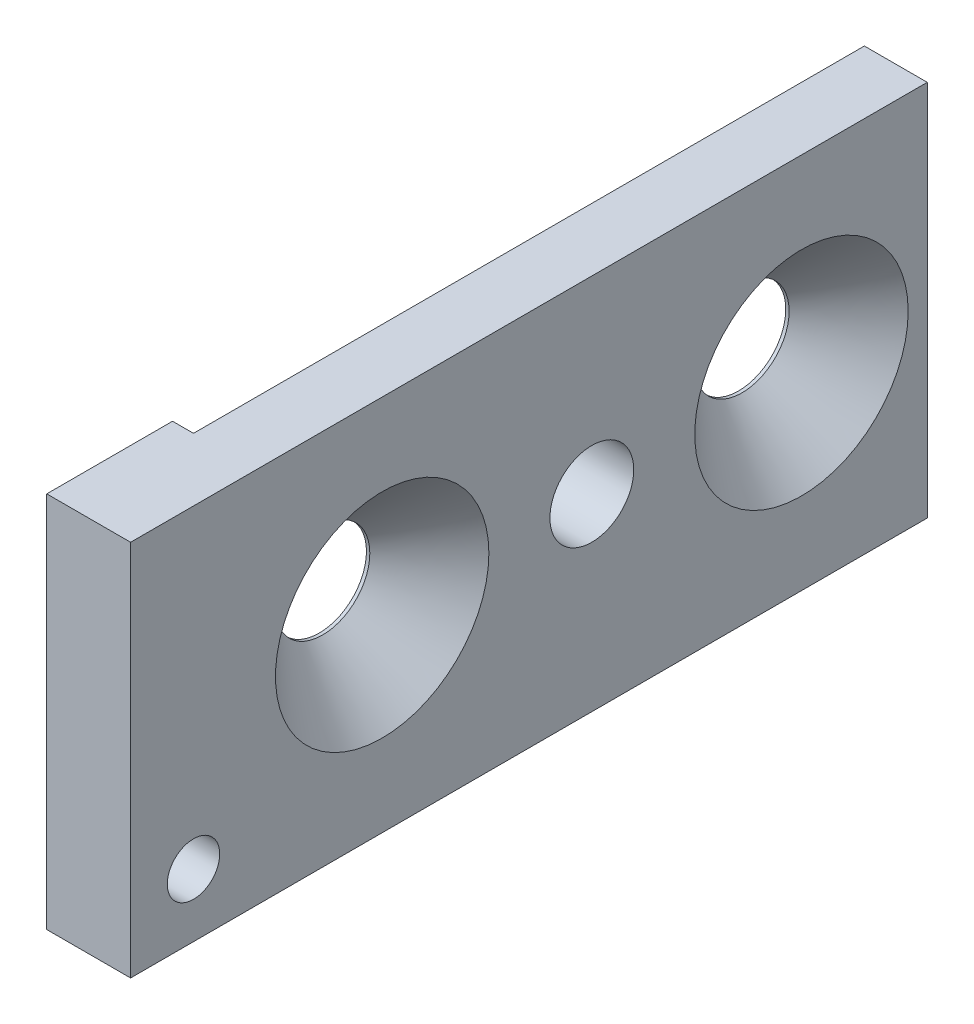
ISO-10303-21;
HEADER;
FILE_DESCRIPTION(('STEP AP214'),'2;1');
FILE_NAME('part.step','',(''),(''),'','','');
FILE_SCHEMA(('AUTOMOTIVE_DESIGN { 1 0 10303 214 1 1 1 1 }'));
ENDSEC;
DATA;
#1=APPLICATION_CONTEXT('core data for automotive mechanical design processes');
#2=APPLICATION_PROTOCOL_DEFINITION('international standard','automotive_design',2000,#1);
#3=PRODUCT_CONTEXT('',#1,'mechanical');
#4=PRODUCT('Part','Part','',(#3));
#5=PRODUCT_RELATED_PRODUCT_CATEGORY('part','',(#4));
#6=PRODUCT_DEFINITION_FORMATION('','',#4);
#7=PRODUCT_DEFINITION_CONTEXT('part definition',#1,'design');
#8=PRODUCT_DEFINITION('design','',#6,#7);
#9=PRODUCT_DEFINITION_SHAPE('','',#8);
#10=(LENGTH_UNIT() NAMED_UNIT(*) SI_UNIT(.MILLI.,.METRE.));
#11=(NAMED_UNIT(*) PLANE_ANGLE_UNIT() SI_UNIT($,.RADIAN.));
#12=(NAMED_UNIT(*) SI_UNIT($,.STERADIAN.) SOLID_ANGLE_UNIT());
#13=UNCERTAINTY_MEASURE_WITH_UNIT(LENGTH_MEASURE(1.E-05),#10,'distance_accuracy_value','');
#14=(GEOMETRIC_REPRESENTATION_CONTEXT(3) GLOBAL_UNCERTAINTY_ASSIGNED_CONTEXT((#13)) GLOBAL_UNIT_ASSIGNED_CONTEXT((#10,
#11,#12)) REPRESENTATION_CONTEXT('',''));
#15=CARTESIAN_POINT('',(0.,0.,0.));
#16=DIRECTION('',(0.,0.,1.));
#17=DIRECTION('',(1.,0.,0.));
#18=AXIS2_PLACEMENT_3D('',#15,#16,#17);
#19=CARTESIAN_POINT('',(3.,0.,0.));
#20=DIRECTION('',(1.,0.,0.));
#21=DIRECTION('',(0.,0.,-1.));
#22=AXIS2_PLACEMENT_3D('',#19,#20,#21);
#23=PLANE('',#22);
#24=CARTESIAN_POINT('',(3.,0.,10.));
#25=DIRECTION('',(1.,0.,0.));
#26=DIRECTION('',(0.,0.,-1.));
#27=AXIS2_PLACEMENT_3D('',#24,#25,#26);
#28=CIRCLE('',#27,5.09);
#29=CARTESIAN_POINT('',(3.,0.,4.91));
#30=VERTEX_POINT('',#29);
#31=EDGE_CURVE('E236',#30,#30,#28,.T.);
#32=ORIENTED_EDGE('',*,*,#31,.F.);
#33=EDGE_LOOP('',(#32));
#34=FACE_BOUND('',#33,.T.);
#35=CARTESIAN_POINT('',(3.,0.,-10.));
#36=DIRECTION('',(1.,0.,0.));
#37=DIRECTION('',(0.,0.,-1.));
#38=AXIS2_PLACEMENT_3D('',#35,#36,#37);
#39=CIRCLE('',#38,5.09);
#40=CARTESIAN_POINT('',(3.,0.,-15.09));
#41=VERTEX_POINT('',#40);
#42=EDGE_CURVE('E145',#41,#41,#39,.T.);
#43=ORIENTED_EDGE('',*,*,#42,.F.);
#44=EDGE_LOOP('',(#43));
#45=FACE_BOUND('',#44,.T.);
#46=CARTESIAN_POINT('',(3.,-6.,19.));
#47=DIRECTION('',(1.,0.,0.));
#48=DIRECTION('',(0.,0.,-1.));
#49=AXIS2_PLACEMENT_3D('',#46,#47,#48);
#50=CIRCLE('',#49,1.25);
#51=CARTESIAN_POINT('',(3.,-6.,17.75));
#52=VERTEX_POINT('',#51);
#53=EDGE_CURVE('E100',#52,#52,#50,.T.);
#54=ORIENTED_EDGE('',*,*,#53,.F.);
#55=EDGE_LOOP('',(#54));
#56=FACE_BOUND('',#55,.T.);
#57=CARTESIAN_POINT('',(3.,0.,0.));
#58=DIRECTION('',(1.,0.,0.));
#59=DIRECTION('',(0.,0.,-1.));
#60=AXIS2_PLACEMENT_3D('',#57,#58,#59);
#61=CIRCLE('',#60,2.);
#62=CARTESIAN_POINT('',(3.,0.,-2.));
#63=VERTEX_POINT('',#62);
#64=EDGE_CURVE('E89',#63,#63,#61,.T.);
#65=ORIENTED_EDGE('',*,*,#64,.F.);
#66=EDGE_LOOP('',(#65));
#67=FACE_BOUND('',#66,.T.);
#68=DIRECTION('',(0.,0.,1.));
#69=VECTOR('',#68,1.);
#70=CARTESIAN_POINT('',(3.,9.,16.));
#71=LINE('',#70,#69);
#72=CARTESIAN_POINT('',(3.,9.,-16.));
#73=VERTEX_POINT('',#72);
#74=CARTESIAN_POINT('',(3.,9.,22.));
#75=VERTEX_POINT('',#74);
#76=EDGE_CURVE('E127',#73,#75,#71,.T.);
#77=ORIENTED_EDGE('',*,*,#76,.T.);
#78=DIRECTION('',(0.,1.,0.));
#79=VECTOR('',#78,1.);
#80=CARTESIAN_POINT('',(3.,9.,22.));
#81=LINE('',#80,#79);
#82=CARTESIAN_POINT('',(3.,-9.,22.));
#83=VERTEX_POINT('',#82);
#84=EDGE_CURVE('E153',#83,#75,#81,.T.);
#85=ORIENTED_EDGE('',*,*,#84,.F.);
#86=DIRECTION('',(0.,0.,-1.));
#87=VECTOR('',#86,1.);
#88=CARTESIAN_POINT('',(3.,-9.,16.));
#89=LINE('',#88,#87);
#90=CARTESIAN_POINT('',(3.,-9.,-16.));
#91=VERTEX_POINT('',#90);
#92=EDGE_CURVE('E79',#83,#91,#89,.T.);
#93=ORIENTED_EDGE('',*,*,#92,.T.);
#94=DIRECTION('',(0.,1.,0.));
#95=VECTOR('',#94,1.);
#96=CARTESIAN_POINT('',(3.,9.,-16.));
#97=LINE('',#96,#95);
#98=EDGE_CURVE('E51',#91,#73,#97,.T.);
#99=ORIENTED_EDGE('',*,*,#98,.T.);
#100=EDGE_LOOP('',(#77,#85,#93,#99));
#101=FACE_BOUND('',#100,.T.);
#102=ADVANCED_FACE('F32',(#34,#45,#56,#67,#101),#23,.T.);
#103=CARTESIAN_POINT('',(0.,0.,0.));
#104=DIRECTION('',(1.,0.,0.));
#105=DIRECTION('',(0.,0.,-1.));
#106=AXIS2_PLACEMENT_3D('',#103,#104,#105);
#107=PLANE('',#106);
#108=CARTESIAN_POINT('',(0.,0.,10.));
#109=DIRECTION('',(1.,0.,0.));
#110=DIRECTION('',(0.,0.,-1.));
#111=AXIS2_PLACEMENT_3D('',#108,#109,#110);
#112=CIRCLE('',#111,2.25);
#113=CARTESIAN_POINT('',(0.,0.,7.75));
#114=VERTEX_POINT('',#113);
#115=EDGE_CURVE('E36',#114,#114,#112,.T.);
#116=ORIENTED_EDGE('',*,*,#115,.T.);
#117=EDGE_LOOP('',(#116));
#118=FACE_BOUND('',#117,.T.);
#119=CARTESIAN_POINT('',(0.,0.,-10.));
#120=DIRECTION('',(1.,0.,0.));
#121=DIRECTION('',(0.,0.,-1.));
#122=AXIS2_PLACEMENT_3D('',#119,#120,#121);
#123=CIRCLE('',#122,2.25);
#124=CARTESIAN_POINT('',(0.,0.,-12.25));
#125=VERTEX_POINT('',#124);
#126=EDGE_CURVE('E137',#125,#125,#123,.T.);
#127=ORIENTED_EDGE('',*,*,#126,.T.);
#128=EDGE_LOOP('',(#127));
#129=FACE_BOUND('',#128,.T.);
#130=CARTESIAN_POINT('',(0.,0.,0.));
#131=DIRECTION('',(1.,0.,0.));
#132=DIRECTION('',(0.,0.,-1.));
#133=AXIS2_PLACEMENT_3D('',#130,#131,#132);
#134=CIRCLE('',#133,2.);
#135=CARTESIAN_POINT('',(0.,0.,-2.));
#136=VERTEX_POINT('',#135);
#137=EDGE_CURVE('E117',#136,#136,#134,.T.);
#138=ORIENTED_EDGE('',*,*,#137,.T.);
#139=EDGE_LOOP('',(#138));
#140=FACE_BOUND('',#139,.T.);
#141=DIRECTION('',(0.,-1.,0.));
#142=VECTOR('',#141,1.);
#143=CARTESIAN_POINT('',(0.,9.,16.));
#144=LINE('',#143,#142);
#145=CARTESIAN_POINT('',(0.,9.,16.));
#146=VERTEX_POINT('',#145);
#147=CARTESIAN_POINT('',(0.,-9.,16.));
#148=VERTEX_POINT('',#147);
#149=EDGE_CURVE('E83',#146,#148,#144,.T.);
#150=ORIENTED_EDGE('',*,*,#149,.F.);
#151=DIRECTION('',(0.,0.,1.));
#152=VECTOR('',#151,1.);
#153=CARTESIAN_POINT('',(0.,9.,16.));
#154=LINE('',#153,#152);
#155=CARTESIAN_POINT('',(0.,9.,-16.));
#156=VERTEX_POINT('',#155);
#157=EDGE_CURVE('E69',#156,#146,#154,.T.);
#158=ORIENTED_EDGE('',*,*,#157,.F.);
#159=DIRECTION('',(0.,1.,0.));
#160=VECTOR('',#159,1.);
#161=CARTESIAN_POINT('',(0.,9.,-16.));
#162=LINE('',#161,#160);
#163=CARTESIAN_POINT('',(0.,-9.,-16.));
#164=VERTEX_POINT('',#163);
#165=EDGE_CURVE('E63',#164,#156,#162,.T.);
#166=ORIENTED_EDGE('',*,*,#165,.F.);
#167=DIRECTION('',(0.,0.,-1.));
#168=VECTOR('',#167,1.);
#169=CARTESIAN_POINT('',(0.,-9.,16.));
#170=LINE('',#169,#168);
#171=EDGE_CURVE('E85',#148,#164,#170,.T.);
#172=ORIENTED_EDGE('',*,*,#171,.F.);
#173=EDGE_LOOP('',(#150,#158,#166,#172));
#174=FACE_BOUND('',#173,.T.);
#175=ADVANCED_FACE('F84',(#118,#129,#140,#174),#107,.F.);
#176=CARTESIAN_POINT('',(3.,-9.,16.));
#177=DIRECTION('',(0.,1.,0.));
#178=DIRECTION('',(0.,0.,1.));
#179=AXIS2_PLACEMENT_3D('',#176,#177,#178);
#180=PLANE('',#179);
#181=ORIENTED_EDGE('',*,*,#171,.T.);
#182=DIRECTION('',(-1.,0.,0.));
#183=VECTOR('',#182,1.);
#184=CARTESIAN_POINT('',(3.,-9.,-16.));
#185=LINE('',#184,#183);
#186=EDGE_CURVE('E11',#91,#164,#185,.T.);
#187=ORIENTED_EDGE('',*,*,#186,.F.);
#188=ORIENTED_EDGE('',*,*,#92,.F.);
#189=DIRECTION('',(1.,0.,0.));
#190=VECTOR('',#189,1.);
#191=CARTESIAN_POINT('',(3.,-9.,22.));
#192=LINE('',#191,#190);
#193=CARTESIAN_POINT('',(-0.999999999999997,-9.,22.));
#194=VERTEX_POINT('',#193);
#195=EDGE_CURVE('E110',#194,#83,#192,.T.);
#196=ORIENTED_EDGE('',*,*,#195,.F.);
#197=DIRECTION('',(0.,0.,-1.));
#198=VECTOR('',#197,1.);
#199=CARTESIAN_POINT('',(-0.999999999999997,-9.,22.));
#200=LINE('',#199,#198);
#201=CARTESIAN_POINT('',(-0.999999999999997,-9.,16.));
#202=VERTEX_POINT('',#201);
#203=EDGE_CURVE('E114',#194,#202,#200,.T.);
#204=ORIENTED_EDGE('',*,*,#203,.T.);
#205=DIRECTION('',(1.,0.,0.));
#206=VECTOR('',#205,1.);
#207=CARTESIAN_POINT('',(3.,-9.,16.));
#208=LINE('',#207,#206);
#209=EDGE_CURVE('E97',#202,#148,#208,.T.);
#210=ORIENTED_EDGE('',*,*,#209,.T.);
#211=EDGE_LOOP('',(#181,#187,#188,#196,#204,#210));
#212=FACE_BOUND('',#211,.T.);
#213=ADVANCED_FACE('F34',(#212),#180,.F.);
#214=CARTESIAN_POINT('',(3.,9.,-16.));
#215=DIRECTION('',(0.,0.,1.));
#216=DIRECTION('',(1.,0.,0.));
#217=AXIS2_PLACEMENT_3D('',#214,#215,#216);
#218=PLANE('',#217);
#219=ORIENTED_EDGE('',*,*,#165,.T.);
#220=DIRECTION('',(-1.,0.,0.));
#221=VECTOR('',#220,1.);
#222=CARTESIAN_POINT('',(3.,9.,-16.));
#223=LINE('',#222,#221);
#224=EDGE_CURVE('E42',#73,#156,#223,.T.);
#225=ORIENTED_EDGE('',*,*,#224,.F.);
#226=ORIENTED_EDGE('',*,*,#98,.F.);
#227=ORIENTED_EDGE('',*,*,#186,.T.);
#228=EDGE_LOOP('',(#219,#225,#226,#227));
#229=FACE_BOUND('',#228,.T.);
#230=ADVANCED_FACE('F182',(#229),#218,.F.);
#231=CARTESIAN_POINT('',(3.,9.,16.));
#232=DIRECTION('',(0.,-1.,0.));
#233=DIRECTION('',(0.,0.,-1.));
#234=AXIS2_PLACEMENT_3D('',#231,#232,#233);
#235=PLANE('',#234);
#236=ORIENTED_EDGE('',*,*,#157,.T.);
#237=DIRECTION('',(-1.,0.,0.));
#238=VECTOR('',#237,1.);
#239=CARTESIAN_POINT('',(3.,9.,16.));
#240=LINE('',#239,#238);
#241=CARTESIAN_POINT('',(-1.,9.,16.));
#242=VERTEX_POINT('',#241);
#243=EDGE_CURVE('E75',#146,#242,#240,.T.);
#244=ORIENTED_EDGE('',*,*,#243,.T.);
#245=DIRECTION('',(0.,0.,-1.));
#246=VECTOR('',#245,1.);
#247=CARTESIAN_POINT('',(-1.,9.,22.));
#248=LINE('',#247,#246);
#249=CARTESIAN_POINT('',(-1.,9.,22.));
#250=VERTEX_POINT('',#249);
#251=EDGE_CURVE('E116',#250,#242,#248,.T.);
#252=ORIENTED_EDGE('',*,*,#251,.F.);
#253=DIRECTION('',(-1.,0.,0.));
#254=VECTOR('',#253,1.);
#255=CARTESIAN_POINT('',(3.,9.,22.));
#256=LINE('',#255,#254);
#257=EDGE_CURVE('E156',#75,#250,#256,.T.);
#258=ORIENTED_EDGE('',*,*,#257,.F.);
#259=ORIENTED_EDGE('',*,*,#76,.F.);
#260=ORIENTED_EDGE('',*,*,#224,.T.);
#261=EDGE_LOOP('',(#236,#244,#252,#258,#259,#260));
#262=FACE_BOUND('',#261,.T.);
#263=ADVANCED_FACE('F71',(#262),#235,.F.);
#264=CARTESIAN_POINT('',(3.,0.,0.));
#265=DIRECTION('',(-1.,0.,0.));
#266=DIRECTION('',(0.,0.,1.));
#267=AXIS2_PLACEMENT_3D('',#264,#265,#266);
#268=CYLINDRICAL_SURFACE('',#267,2.);
#269=ORIENTED_EDGE('',*,*,#64,.T.);
#270=EDGE_LOOP('',(#269));
#271=FACE_BOUND('',#270,.T.);
#272=ORIENTED_EDGE('',*,*,#137,.F.);
#273=EDGE_LOOP('',(#272));
#274=FACE_BOUND('',#273,.T.);
#275=ADVANCED_FACE('F188',(#271,#274),#268,.F.);
#276=CARTESIAN_POINT('',(-1.,9.,22.));
#277=DIRECTION('',(1.,0.,0.));
#278=DIRECTION('',(0.,1.,0.));
#279=AXIS2_PLACEMENT_3D('',#276,#277,#278);
#280=PLANE('',#279);
#281=CARTESIAN_POINT('',(-0.999999999999998,-6.,19.));
#282=DIRECTION('',(1.,0.,0.));
#283=DIRECTION('',(0.,1.,0.));
#284=AXIS2_PLACEMENT_3D('',#281,#282,#283);
#285=CIRCLE('',#284,1.25);
#286=CARTESIAN_POINT('',(-0.999999999999998,-4.75,19.));
#287=VERTEX_POINT('',#286);
#288=EDGE_CURVE('E95',#287,#287,#285,.T.);
#289=ORIENTED_EDGE('',*,*,#288,.T.);
#290=EDGE_LOOP('',(#289));
#291=FACE_BOUND('',#290,.T.);
#292=DIRECTION('',(0.,-1.,0.));
#293=VECTOR('',#292,1.);
#294=CARTESIAN_POINT('',(-1.,9.,16.));
#295=LINE('',#294,#293);
#296=EDGE_CURVE('E94',#242,#202,#295,.T.);
#297=ORIENTED_EDGE('',*,*,#296,.T.);
#298=ORIENTED_EDGE('',*,*,#203,.F.);
#299=DIRECTION('',(0.,-1.,0.));
#300=VECTOR('',#299,1.);
#301=CARTESIAN_POINT('',(-1.,9.,22.));
#302=LINE('',#301,#300);
#303=EDGE_CURVE('E158',#250,#194,#302,.T.);
#304=ORIENTED_EDGE('',*,*,#303,.F.);
#305=ORIENTED_EDGE('',*,*,#251,.T.);
#306=EDGE_LOOP('',(#297,#298,#304,#305));
#307=FACE_BOUND('',#306,.T.);
#308=ADVANCED_FACE('F181',(#291,#307),#280,.F.);
#309=CARTESIAN_POINT('',(0.,0.,22.));
#310=DIRECTION('',(0.,0.,-1.));
#311=DIRECTION('',(-1.,0.,0.));
#312=AXIS2_PLACEMENT_3D('',#309,#310,#311);
#313=PLANE('',#312);
#314=ORIENTED_EDGE('',*,*,#84,.T.);
#315=ORIENTED_EDGE('',*,*,#257,.T.);
#316=ORIENTED_EDGE('',*,*,#303,.T.);
#317=ORIENTED_EDGE('',*,*,#195,.T.);
#318=EDGE_LOOP('',(#314,#315,#316,#317));
#319=FACE_BOUND('',#318,.T.);
#320=ADVANCED_FACE('F167',(#319),#313,.F.);
#321=CARTESIAN_POINT('',(0.,0.,16.));
#322=DIRECTION('',(0.,0.,-1.));
#323=DIRECTION('',(-1.,0.,0.));
#324=AXIS2_PLACEMENT_3D('',#321,#322,#323);
#325=PLANE('',#324);
#326=ORIENTED_EDGE('',*,*,#243,.F.);
#327=ORIENTED_EDGE('',*,*,#149,.T.);
#328=ORIENTED_EDGE('',*,*,#209,.F.);
#329=ORIENTED_EDGE('',*,*,#296,.F.);
#330=EDGE_LOOP('',(#326,#327,#328,#329));
#331=FACE_BOUND('',#330,.T.);
#332=ADVANCED_FACE('F92',(#331),#325,.T.);
#333=CARTESIAN_POINT('',(-1.000025,-6.,19.));
#334=DIRECTION('',(1.,0.,0.));
#335=DIRECTION('',(0.,0.,-1.));
#336=AXIS2_PLACEMENT_3D('',#333,#334,#335);
#337=CYLINDRICAL_SURFACE('',#336,1.25);
#338=ORIENTED_EDGE('',*,*,#53,.T.);
#339=EDGE_LOOP('',(#338));
#340=FACE_BOUND('',#339,.T.);
#341=ORIENTED_EDGE('',*,*,#288,.F.);
#342=EDGE_LOOP('',(#341));
#343=FACE_BOUND('',#342,.T.);
#344=ADVANCED_FACE('F209',(#340,#343),#337,.F.);
#345=CARTESIAN_POINT('',(3.,0.,-10.));
#346=DIRECTION('',(1.,0.,0.));
#347=DIRECTION('',(0.,0.,-1.));
#348=AXIS2_PLACEMENT_3D('',#345,#346,#347);
#349=CYLINDRICAL_SURFACE('',#348,2.25);
#350=CARTESIAN_POINT('',(0.16,0.,-10.));
#351=DIRECTION('',(1.,0.,0.));
#352=DIRECTION('',(0.,0.,-1.));
#353=AXIS2_PLACEMENT_3D('',#350,#351,#352);
#354=CIRCLE('',#353,2.25);
#355=CARTESIAN_POINT('',(0.16,0.,-12.25));
#356=VERTEX_POINT('',#355);
#357=EDGE_CURVE('E139',#356,#356,#354,.T.);
#358=ORIENTED_EDGE('',*,*,#357,.T.);
#359=EDGE_LOOP('',(#358));
#360=FACE_BOUND('',#359,.T.);
#361=ORIENTED_EDGE('',*,*,#126,.F.);
#362=EDGE_LOOP('',(#361));
#363=FACE_BOUND('',#362,.T.);
#364=ADVANCED_FACE('F214',(#360,#363),#349,.F.);
#365=CARTESIAN_POINT('',(3.,0.,-10.));
#366=DIRECTION('',(1.,0.,0.));
#367=DIRECTION('',(0.,0.,-1.));
#368=AXIS2_PLACEMENT_3D('',#365,#366,#367);
#369=CONICAL_SURFACE('',#368,5.09,0.785398163397448);
#370=ORIENTED_EDGE('',*,*,#357,.F.);
#371=EDGE_LOOP('',(#370));
#372=FACE_BOUND('',#371,.T.);
#373=ORIENTED_EDGE('',*,*,#42,.T.);
#374=EDGE_LOOP('',(#373));
#375=FACE_BOUND('',#374,.T.);
#376=ADVANCED_FACE('F218',(#372,#375),#369,.F.);
#377=CARTESIAN_POINT('',(3.,0.,10.));
#378=DIRECTION('',(1.,0.,0.));
#379=DIRECTION('',(0.,0.,-1.));
#380=AXIS2_PLACEMENT_3D('',#377,#378,#379);
#381=CYLINDRICAL_SURFACE('',#380,2.25);
#382=CARTESIAN_POINT('',(0.16,0.,10.));
#383=DIRECTION('',(1.,0.,0.));
#384=DIRECTION('',(0.,0.,-1.));
#385=AXIS2_PLACEMENT_3D('',#382,#383,#384);
#386=CIRCLE('',#385,2.25);
#387=CARTESIAN_POINT('',(0.16,0.,7.75));
#388=VERTEX_POINT('',#387);
#389=EDGE_CURVE('E234',#388,#388,#386,.T.);
#390=ORIENTED_EDGE('',*,*,#389,.T.);
#391=EDGE_LOOP('',(#390));
#392=FACE_BOUND('',#391,.T.);
#393=ORIENTED_EDGE('',*,*,#115,.F.);
#394=EDGE_LOOP('',(#393));
#395=FACE_BOUND('',#394,.T.);
#396=ADVANCED_FACE('F221',(#392,#395),#381,.F.);
#397=CARTESIAN_POINT('',(3.,0.,10.));
#398=DIRECTION('',(1.,0.,0.));
#399=DIRECTION('',(0.,0.,-1.));
#400=AXIS2_PLACEMENT_3D('',#397,#398,#399);
#401=CONICAL_SURFACE('',#400,5.09,0.785398163397448);
#402=ORIENTED_EDGE('',*,*,#389,.F.);
#403=EDGE_LOOP('',(#402));
#404=FACE_BOUND('',#403,.T.);
#405=ORIENTED_EDGE('',*,*,#31,.T.);
#406=EDGE_LOOP('',(#405));
#407=FACE_BOUND('',#406,.T.);
#408=ADVANCED_FACE('F225',(#404,#407),#401,.F.);
#409=CLOSED_SHELL('',(#102,#175,#213,#230,#263,#275,#308,#320,#332,#344,#364,#376,#396,#408));
#410=MANIFOLD_SOLID_BREP('B2',#409);
#411=ADVANCED_BREP_SHAPE_REPRESENTATION('',(#18,#410),#14);
#412=SHAPE_DEFINITION_REPRESENTATION(#9,#411);
ENDSEC;
END-ISO-10303-21;
